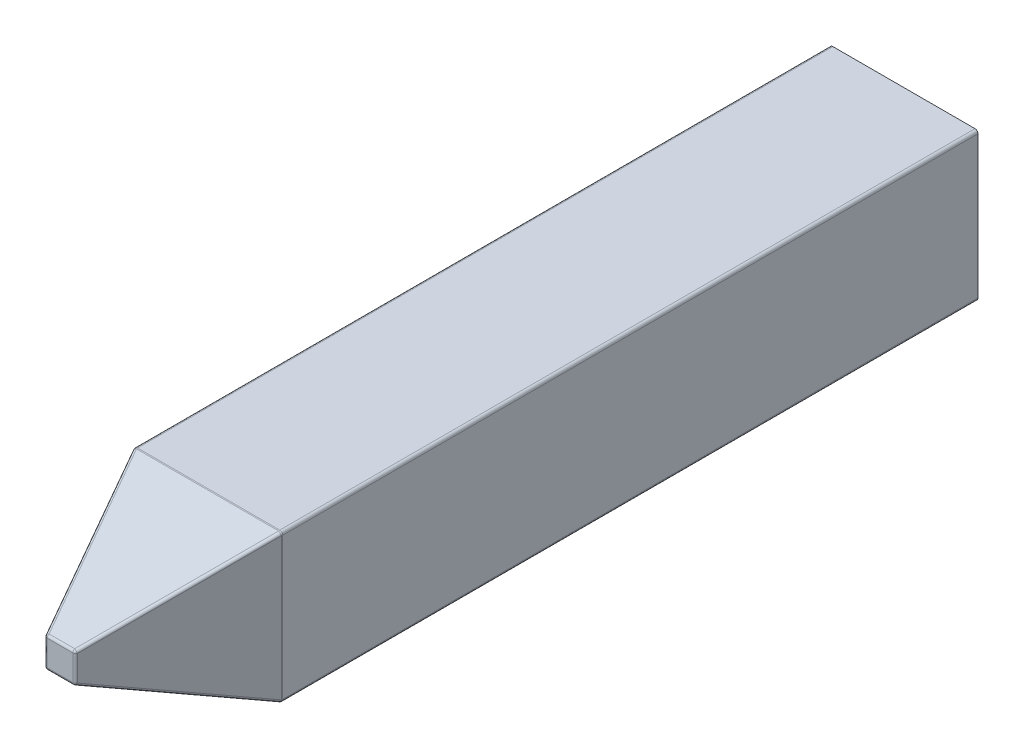
ISO-10303-21;
HEADER;
FILE_DESCRIPTION(('STEP AP214'),'2;1');
FILE_NAME('part.step','',(''),(''),'','','');
FILE_SCHEMA(('AUTOMOTIVE_DESIGN { 1 0 10303 214 1 1 1 1 }'));
ENDSEC;
DATA;
#1=APPLICATION_CONTEXT('core data for automotive mechanical design processes');
#2=APPLICATION_PROTOCOL_DEFINITION('international standard','automotive_design',2000,#1);
#3=PRODUCT_CONTEXT('',#1,'mechanical');
#4=PRODUCT('Part','Part','',(#3));
#5=PRODUCT_RELATED_PRODUCT_CATEGORY('part','',(#4));
#6=PRODUCT_DEFINITION_FORMATION('','',#4);
#7=PRODUCT_DEFINITION_CONTEXT('part definition',#1,'design');
#8=PRODUCT_DEFINITION('design','',#6,#7);
#9=PRODUCT_DEFINITION_SHAPE('','',#8);
#10=(LENGTH_UNIT() NAMED_UNIT(*) SI_UNIT(.MILLI.,.METRE.));
#11=(NAMED_UNIT(*) PLANE_ANGLE_UNIT() SI_UNIT($,.RADIAN.));
#12=(NAMED_UNIT(*) SI_UNIT($,.STERADIAN.) SOLID_ANGLE_UNIT());
#13=UNCERTAINTY_MEASURE_WITH_UNIT(LENGTH_MEASURE(1.E-05),#10,'distance_accuracy_value','');
#14=(GEOMETRIC_REPRESENTATION_CONTEXT(3) GLOBAL_UNCERTAINTY_ASSIGNED_CONTEXT((#13)) GLOBAL_UNIT_ASSIGNED_CONTEXT((#10,
#11,#12)) REPRESENTATION_CONTEXT('',''));
#15=CARTESIAN_POINT('',(0.,0.,0.));
#16=DIRECTION('',(0.,0.,1.));
#17=DIRECTION('',(1.,0.,0.));
#18=AXIS2_PLACEMENT_3D('',#15,#16,#17);
#19=CARTESIAN_POINT('',(0.,10.25,1.5));
#20=DIRECTION('',(0.,0.,-1.));
#21=DIRECTION('',(0.,-1.,0.));
#22=AXIS2_PLACEMENT_3D('',#19,#20,#21);
#23=PLANE('',#22);
#24=DIRECTION('',(0.,1.,0.));
#25=VECTOR('',#24,1.);
#26=CARTESIAN_POINT('',(4.25,-0.25,1.5));
#27=LINE('',#26,#25);
#28=CARTESIAN_POINT('',(4.25,-0.24,1.5));
#29=VERTEX_POINT('',#28);
#30=CARTESIAN_POINT('',(4.25,0.24,1.5));
#31=VERTEX_POINT('',#30);
#32=EDGE_CURVE('E11',#29,#31,#27,.T.);
#33=ORIENTED_EDGE('',*,*,#32,.F.);
#34=CARTESIAN_POINT('',(4.24,-0.24,1.5));
#35=DIRECTION('',(0.,0.,1.));
#36=DIRECTION('',(-1.,0.,0.));
#37=AXIS2_PLACEMENT_3D('',#34,#35,#36);
#38=CIRCLE('',#37,0.01);
#39=CARTESIAN_POINT('',(4.24,-0.25,1.5));
#40=VERTEX_POINT('',#39);
#41=EDGE_CURVE('E360',#40,#29,#38,.T.);
#42=ORIENTED_EDGE('',*,*,#41,.F.);
#43=DIRECTION('',(1.,0.,0.));
#44=VECTOR('',#43,1.);
#45=CARTESIAN_POINT('',(3.75,-0.25,1.5));
#46=LINE('',#45,#44);
#47=CARTESIAN_POINT('',(3.76,-0.25,1.5));
#48=VERTEX_POINT('',#47);
#49=EDGE_CURVE('E199',#48,#40,#46,.T.);
#50=ORIENTED_EDGE('',*,*,#49,.F.);
#51=CARTESIAN_POINT('',(3.76,-0.24,1.5));
#52=DIRECTION('',(0.,0.,1.));
#53=DIRECTION('',(-1.,0.,0.));
#54=AXIS2_PLACEMENT_3D('',#51,#52,#53);
#55=CIRCLE('',#54,0.01);
#56=CARTESIAN_POINT('',(3.75,-0.24,1.5));
#57=VERTEX_POINT('',#56);
#58=EDGE_CURVE('E245',#57,#48,#55,.T.);
#59=ORIENTED_EDGE('',*,*,#58,.F.);
#60=DIRECTION('',(0.,-1.,0.));
#61=VECTOR('',#60,1.);
#62=CARTESIAN_POINT('',(3.75,0.25,1.5));
#63=LINE('',#62,#61);
#64=CARTESIAN_POINT('',(3.75,0.24,1.5));
#65=VERTEX_POINT('',#64);
#66=EDGE_CURVE('E187',#65,#57,#63,.T.);
#67=ORIENTED_EDGE('',*,*,#66,.F.);
#68=CARTESIAN_POINT('',(3.76,0.24,1.5));
#69=DIRECTION('',(0.,0.,1.));
#70=DIRECTION('',(-1.,0.,0.));
#71=AXIS2_PLACEMENT_3D('',#68,#69,#70);
#72=CIRCLE('',#71,0.01);
#73=CARTESIAN_POINT('',(3.76,0.25,1.5));
#74=VERTEX_POINT('',#73);
#75=EDGE_CURVE('E185',#74,#65,#72,.T.);
#76=ORIENTED_EDGE('',*,*,#75,.F.);
#77=DIRECTION('',(-1.,0.,0.));
#78=VECTOR('',#77,1.);
#79=CARTESIAN_POINT('',(4.25,0.25,1.5));
#80=LINE('',#79,#78);
#81=CARTESIAN_POINT('',(4.24,0.25,1.5));
#82=VERTEX_POINT('',#81);
#83=EDGE_CURVE('E28',#82,#74,#80,.T.);
#84=ORIENTED_EDGE('',*,*,#83,.F.);
#85=CARTESIAN_POINT('',(4.24,0.24,1.5));
#86=DIRECTION('',(0.,0.,1.));
#87=DIRECTION('',(-1.,0.,0.));
#88=AXIS2_PLACEMENT_3D('',#85,#86,#87);
#89=CIRCLE('',#88,0.01);
#90=EDGE_CURVE('E301',#31,#82,#89,.T.);
#91=ORIENTED_EDGE('',*,*,#90,.F.);
#92=EDGE_LOOP('',(#33,#42,#50,#59,#67,#76,#84,#91));
#93=FACE_BOUND('',#92,.T.);
#94=ADVANCED_FACE('F17',(#93),#23,.T.);
#95=CARTESIAN_POINT('',(4.25,-0.25,-1.15));
#96=DIRECTION('',(1.,0.,0.));
#97=DIRECTION('',(0.,1.,0.));
#98=AXIS2_PLACEMENT_3D('',#95,#96,#97);
#99=PLANE('',#98);
#100=DIRECTION('',(0.,0.,1.));
#101=VECTOR('',#100,1.);
#102=CARTESIAN_POINT('',(4.25,-0.24,-1.15));
#103=LINE('',#102,#101);
#104=CARTESIAN_POINT('',(4.25,-0.24,3.848074175964));
#105=VERTEX_POINT('',#104);
#106=EDGE_CURVE('E246',#29,#105,#103,.T.);
#107=ORIENTED_EDGE('',*,*,#106,.F.);
#108=ORIENTED_EDGE('',*,*,#32,.T.);
#109=DIRECTION('',(0.,0.,-1.));
#110=VECTOR('',#109,1.);
#111=CARTESIAN_POINT('',(4.25,0.24,-1.15));
#112=LINE('',#111,#110);
#113=CARTESIAN_POINT('',(4.25,0.24,3.848074175964));
#114=VERTEX_POINT('',#113);
#115=EDGE_CURVE('E349',#114,#31,#112,.T.);
#116=ORIENTED_EDGE('',*,*,#115,.F.);
#117=DIRECTION('',(0.,1.,0.));
#118=VECTOR('',#117,1.);
#119=CARTESIAN_POINT('',(4.25,-0.1875,3.848074175964));
#120=LINE('',#119,#118);
#121=EDGE_CURVE('E252',#105,#114,#120,.T.);
#122=ORIENTED_EDGE('',*,*,#121,.F.);
#123=EDGE_LOOP('',(#107,#108,#116,#122));
#124=FACE_BOUND('',#123,.T.);
#125=ADVANCED_FACE('F425',(#124),#99,.T.);
#126=CARTESIAN_POINT('',(4.25,0.25,-1.15));
#127=DIRECTION('',(0.,1.,0.));
#128=DIRECTION('',(1.,0.,0.));
#129=AXIS2_PLACEMENT_3D('',#126,#127,#128);
#130=PLANE('',#129);
#131=DIRECTION('',(0.,0.,1.));
#132=VECTOR('',#131,1.);
#133=CARTESIAN_POINT('',(4.24,0.25,-1.15));
#134=LINE('',#133,#132);
#135=CARTESIAN_POINT('',(4.24,0.25,3.848074175964));
#136=VERTEX_POINT('',#135);
#137=EDGE_CURVE('E180',#82,#136,#134,.T.);
#138=ORIENTED_EDGE('',*,*,#137,.F.);
#139=ORIENTED_EDGE('',*,*,#83,.T.);
#140=DIRECTION('',(0.,0.,-1.));
#141=VECTOR('',#140,1.);
#142=CARTESIAN_POINT('',(3.76,0.25,-1.15));
#143=LINE('',#142,#141);
#144=CARTESIAN_POINT('',(3.76,0.25,3.848074175964));
#145=VERTEX_POINT('',#144);
#146=EDGE_CURVE('E178',#145,#74,#143,.T.);
#147=ORIENTED_EDGE('',*,*,#146,.F.);
#148=DIRECTION('',(-1.,0.,0.));
#149=VECTOR('',#148,1.);
#150=CARTESIAN_POINT('',(4.1875,0.25,3.848074175964));
#151=LINE('',#150,#149);
#152=EDGE_CURVE('E209',#136,#145,#151,.T.);
#153=ORIENTED_EDGE('',*,*,#152,.F.);
#154=EDGE_LOOP('',(#138,#139,#147,#153));
#155=FACE_BOUND('',#154,.T.);
#156=ADVANCED_FACE('F175',(#155),#130,.T.);
#157=CARTESIAN_POINT('',(4.24,0.24,-1.15));
#158=DIRECTION('',(0.,0.,1.));
#159=DIRECTION('',(0.707106781186548,0.707106781186548,0.));
#160=AXIS2_PLACEMENT_3D('',#157,#158,#159);
#161=CYLINDRICAL_SURFACE('',#160,0.01);
#162=ORIENTED_EDGE('',*,*,#115,.T.);
#163=ORIENTED_EDGE('',*,*,#90,.T.);
#164=ORIENTED_EDGE('',*,*,#137,.T.);
#165=CARTESIAN_POINT('',(4.24,0.24,3.848074175964));
#166=DIRECTION('',(0.,0.,-1.));
#167=DIRECTION('',(0.,1.,0.));
#168=AXIS2_PLACEMENT_3D('',#165,#166,#167);
#169=CIRCLE('',#168,0.01);
#170=EDGE_CURVE('E232',#136,#114,#169,.T.);
#171=ORIENTED_EDGE('',*,*,#170,.T.);
#172=EDGE_LOOP('',(#162,#163,#164,#171));
#173=FACE_BOUND('',#172,.T.);
#174=ADVANCED_FACE('F418',(#173),#161,.T.);
#175=CARTESIAN_POINT('',(3.75,0.25,-1.15));
#176=DIRECTION('',(-1.,0.,0.));
#177=DIRECTION('',(0.,0.,1.));
#178=AXIS2_PLACEMENT_3D('',#175,#176,#177);
#179=PLANE('',#178);
#180=DIRECTION('',(0.,0.,1.));
#181=VECTOR('',#180,1.);
#182=CARTESIAN_POINT('',(3.75,0.24,-1.15));
#183=LINE('',#182,#181);
#184=CARTESIAN_POINT('',(3.75,0.24,3.848074175964));
#185=VERTEX_POINT('',#184);
#186=EDGE_CURVE('E192',#65,#185,#183,.T.);
#187=ORIENTED_EDGE('',*,*,#186,.F.);
#188=ORIENTED_EDGE('',*,*,#66,.T.);
#189=DIRECTION('',(0.,0.,-1.));
#190=VECTOR('',#189,1.);
#191=CARTESIAN_POINT('',(3.75,-0.24,-1.15));
#192=LINE('',#191,#190);
#193=CARTESIAN_POINT('',(3.75,-0.24,3.848074175964));
#194=VERTEX_POINT('',#193);
#195=EDGE_CURVE('E241',#194,#57,#192,.T.);
#196=ORIENTED_EDGE('',*,*,#195,.F.);
#197=DIRECTION('',(0.,-1.,0.));
#198=VECTOR('',#197,1.);
#199=CARTESIAN_POINT('',(3.75,0.1875,3.848074175964));
#200=LINE('',#199,#198);
#201=EDGE_CURVE('E309',#185,#194,#200,.T.);
#202=ORIENTED_EDGE('',*,*,#201,.F.);
#203=EDGE_LOOP('',(#187,#188,#196,#202));
#204=FACE_BOUND('',#203,.T.);
#205=ADVANCED_FACE('F440',(#204),#179,.T.);
#206=CARTESIAN_POINT('',(3.76,0.24,-1.15));
#207=DIRECTION('',(0.,0.,1.));
#208=DIRECTION('',(-0.707106781186548,0.707106781186548,0.));
#209=AXIS2_PLACEMENT_3D('',#206,#207,#208);
#210=CYLINDRICAL_SURFACE('',#209,0.01);
#211=ORIENTED_EDGE('',*,*,#146,.T.);
#212=ORIENTED_EDGE('',*,*,#75,.T.);
#213=ORIENTED_EDGE('',*,*,#186,.T.);
#214=CARTESIAN_POINT('',(3.76,0.24,3.848074175964));
#215=DIRECTION('',(0.,0.,-1.));
#216=DIRECTION('',(-1.,0.,0.));
#217=AXIS2_PLACEMENT_3D('',#214,#215,#216);
#218=CIRCLE('',#217,0.01);
#219=EDGE_CURVE('E196',#185,#145,#218,.T.);
#220=ORIENTED_EDGE('',*,*,#219,.T.);
#221=EDGE_LOOP('',(#211,#212,#213,#220));
#222=FACE_BOUND('',#221,.T.);
#223=ADVANCED_FACE('F194',(#222),#210,.T.);
#224=CARTESIAN_POINT('',(3.75,-0.25,-1.15));
#225=DIRECTION('',(0.,-1.,0.));
#226=DIRECTION('',(0.,0.,-1.));
#227=AXIS2_PLACEMENT_3D('',#224,#225,#226);
#228=PLANE('',#227);
#229=DIRECTION('',(0.,0.,1.));
#230=VECTOR('',#229,1.);
#231=CARTESIAN_POINT('',(3.76,-0.25,-1.15));
#232=LINE('',#231,#230);
#233=CARTESIAN_POINT('',(3.76,-0.25,3.848074175964));
#234=VERTEX_POINT('',#233);
#235=EDGE_CURVE('E205',#48,#234,#232,.T.);
#236=ORIENTED_EDGE('',*,*,#235,.F.);
#237=ORIENTED_EDGE('',*,*,#49,.T.);
#238=DIRECTION('',(0.,0.,-1.));
#239=VECTOR('',#238,1.);
#240=CARTESIAN_POINT('',(4.24,-0.25,-1.15));
#241=LINE('',#240,#239);
#242=CARTESIAN_POINT('',(4.24,-0.25,3.848074175964));
#243=VERTEX_POINT('',#242);
#244=EDGE_CURVE('E269',#243,#40,#241,.T.);
#245=ORIENTED_EDGE('',*,*,#244,.F.);
#246=DIRECTION('',(1.,0.,0.));
#247=VECTOR('',#246,1.);
#248=CARTESIAN_POINT('',(3.8125,-0.25,3.848074175964));
#249=LINE('',#248,#247);
#250=EDGE_CURVE('E248',#234,#243,#249,.T.);
#251=ORIENTED_EDGE('',*,*,#250,.F.);
#252=EDGE_LOOP('',(#236,#237,#245,#251));
#253=FACE_BOUND('',#252,.T.);
#254=ADVANCED_FACE('F434',(#253),#228,.T.);
#255=CARTESIAN_POINT('',(3.76,-0.24,-1.15));
#256=DIRECTION('',(0.,0.,-1.));
#257=DIRECTION('',(-0.707106781186548,-0.707106781186548,0.));
#258=AXIS2_PLACEMENT_3D('',#255,#256,#257);
#259=CYLINDRICAL_SURFACE('',#258,0.01);
#260=ORIENTED_EDGE('',*,*,#195,.T.);
#261=ORIENTED_EDGE('',*,*,#58,.T.);
#262=ORIENTED_EDGE('',*,*,#235,.T.);
#263=CARTESIAN_POINT('',(3.76,-0.24,3.848074175964));
#264=DIRECTION('',(0.,0.,-1.));
#265=DIRECTION('',(0.,-1.,0.));
#266=AXIS2_PLACEMENT_3D('',#263,#264,#265);
#267=CIRCLE('',#266,0.01);
#268=EDGE_CURVE('E265',#234,#194,#267,.T.);
#269=ORIENTED_EDGE('',*,*,#268,.T.);
#270=EDGE_LOOP('',(#260,#261,#262,#269));
#271=FACE_BOUND('',#270,.T.);
#272=ADVANCED_FACE('F436',(#271),#259,.T.);
#273=CARTESIAN_POINT('',(4.24,-0.24,-1.15));
#274=DIRECTION('',(0.,0.,1.));
#275=DIRECTION('',(0.707106781186548,-0.707106781186548,0.));
#276=AXIS2_PLACEMENT_3D('',#273,#274,#275);
#277=CYLINDRICAL_SURFACE('',#276,0.01);
#278=ORIENTED_EDGE('',*,*,#244,.T.);
#279=ORIENTED_EDGE('',*,*,#41,.T.);
#280=ORIENTED_EDGE('',*,*,#106,.T.);
#281=CARTESIAN_POINT('',(4.24,-0.24,3.848074175964));
#282=DIRECTION('',(0.,0.,-1.));
#283=DIRECTION('',(1.,0.,0.));
#284=AXIS2_PLACEMENT_3D('',#281,#282,#283);
#285=CIRCLE('',#284,0.01);
#286=EDGE_CURVE('E235',#105,#243,#285,.T.);
#287=ORIENTED_EDGE('',*,*,#286,.T.);
#288=EDGE_LOOP('',(#278,#279,#280,#287));
#289=FACE_BOUND('',#288,.T.);
#290=ADVANCED_FACE('F430',(#289),#277,.T.);
#291=CARTESIAN_POINT('',(3.76,-0.24,3.848074175964));
#292=DIRECTION('',(0.,0.,1.));
#293=DIRECTION('',(1.,0.,0.));
#294=AXIS2_PLACEMENT_3D('',#291,#292,#293);
#295=SPHERICAL_SURFACE('',#294,0.01);
#296=CARTESIAN_POINT('',(3.76,-0.24,3.848074175964));
#297=DIRECTION('',(0.,1.,0.));
#298=DIRECTION('',(-1.,0.,0.));
#299=AXIS2_PLACEMENT_3D('',#296,#297,#298);
#300=CIRCLE('',#299,0.01);
#301=CARTESIAN_POINT('',(3.750715233091,-0.24,3.851788082728));
#302=VERTEX_POINT('',#301);
#303=EDGE_CURVE('E324',#194,#302,#300,.T.);
#304=ORIENTED_EDGE('',*,*,#303,.F.);
#305=ORIENTED_EDGE('',*,*,#268,.F.);
#306=CARTESIAN_POINT('',(3.76,-0.24,3.848074175964));
#307=DIRECTION('',(1.,0.,0.));
#308=DIRECTION('',(0.,-0.928476690885259,0.371390676354104));
#309=AXIS2_PLACEMENT_3D('',#306,#307,#308);
#310=CIRCLE('',#309,0.009999999999999);
#311=CARTESIAN_POINT('',(3.76,-0.249284766909,3.851788082728));
#312=VERTEX_POINT('',#311);
#313=EDGE_CURVE('E279',#312,#234,#310,.T.);
#314=ORIENTED_EDGE('',*,*,#313,.F.);
#315=CARTESIAN_POINT('',(3.76,-0.24,3.848074175964));
#316=DIRECTION('',(0.348155311911459,0.348155311910941,0.870388279778646));
#317=DIRECTION('',(-0.928476690885259,0.,0.371390676354104));
#318=AXIS2_PLACEMENT_3D('',#315,#316,#317);
#319=CIRCLE('',#318,0.009999999999999);
#320=EDGE_CURVE('E298',#302,#312,#319,.T.);
#321=ORIENTED_EDGE('',*,*,#320,.F.);
#322=EDGE_LOOP('',(#304,#305,#314,#321));
#323=FACE_BOUND('',#322,.T.);
#324=ADVANCED_FACE('F743',(#323),#295,.T.);
#325=CARTESIAN_POINT('',(4.24,-0.24,3.848074175964));
#326=DIRECTION('',(0.,0.,1.));
#327=DIRECTION('',(1.,0.,0.));
#328=AXIS2_PLACEMENT_3D('',#325,#326,#327);
#329=SPHERICAL_SURFACE('',#328,0.01);
#330=CARTESIAN_POINT('',(4.24,-0.24,3.848074175964));
#331=DIRECTION('',(-0.348155311910942,0.348155311911459,0.870388279778646));
#332=DIRECTION('',(0.,-0.928476690885259,0.371390676354104));
#333=AXIS2_PLACEMENT_3D('',#330,#331,#332);
#334=CIRCLE('',#333,0.01);
#335=CARTESIAN_POINT('',(4.24,-0.249284766909,3.851788082728));
#336=VERTEX_POINT('',#335);
#337=CARTESIAN_POINT('',(4.249284766909,-0.24,3.851788082728));
#338=VERTEX_POINT('',#337);
#339=EDGE_CURVE('E339',#336,#338,#334,.T.);
#340=ORIENTED_EDGE('',*,*,#339,.F.);
#341=CARTESIAN_POINT('',(4.24,-0.24,3.848074175964));
#342=DIRECTION('',(-1.,0.,0.));
#343=DIRECTION('',(0.,-1.,0.));
#344=AXIS2_PLACEMENT_3D('',#341,#342,#343);
#345=CIRCLE('',#344,0.01);
#346=EDGE_CURVE('E306',#243,#336,#345,.T.);
#347=ORIENTED_EDGE('',*,*,#346,.F.);
#348=ORIENTED_EDGE('',*,*,#286,.F.);
#349=CARTESIAN_POINT('',(4.24,-0.24,3.848074175964));
#350=DIRECTION('',(0.,1.,0.));
#351=DIRECTION('',(0.928476690885259,0.,0.371390676354104));
#352=AXIS2_PLACEMENT_3D('',#349,#350,#351);
#353=CIRCLE('',#352,0.009999999999999);
#354=EDGE_CURVE('E285',#338,#105,#353,.T.);
#355=ORIENTED_EDGE('',*,*,#354,.F.);
#356=EDGE_LOOP('',(#340,#347,#348,#355));
#357=FACE_BOUND('',#356,.T.);
#358=ADVANCED_FACE('F776',(#357),#329,.T.);
#359=CARTESIAN_POINT('',(4.24,0.24,3.848074175964));
#360=DIRECTION('',(0.,0.,1.));
#361=DIRECTION('',(1.,0.,0.));
#362=AXIS2_PLACEMENT_3D('',#359,#360,#361);
#363=SPHERICAL_SURFACE('',#362,0.009999999999999);
#364=ORIENTED_EDGE('',*,*,#170,.F.);
#365=CARTESIAN_POINT('',(4.24,0.24,3.848074175964));
#366=DIRECTION('',(-1.,0.,0.));
#367=DIRECTION('',(0.,0.928476690885259,0.371390676354104));
#368=AXIS2_PLACEMENT_3D('',#365,#366,#367);
#369=CIRCLE('',#368,0.009999999999999);
#370=CARTESIAN_POINT('',(4.24,0.249284766909,3.851788082728));
#371=VERTEX_POINT('',#370);
#372=EDGE_CURVE('E217',#371,#136,#369,.T.);
#373=ORIENTED_EDGE('',*,*,#372,.F.);
#374=CARTESIAN_POINT('',(4.24,0.24,3.848074175964));
#375=DIRECTION('',(-0.348155311911459,-0.348155311910941,0.870388279778646));
#376=DIRECTION('',(0.928476690885259,0.,0.371390676354104));
#377=AXIS2_PLACEMENT_3D('',#374,#375,#376);
#378=CIRCLE('',#377,0.009999999999999);
#379=CARTESIAN_POINT('',(4.249284766909,0.24,3.851788082728));
#380=VERTEX_POINT('',#379);
#381=EDGE_CURVE('E230',#380,#371,#378,.T.);
#382=ORIENTED_EDGE('',*,*,#381,.F.);
#383=CARTESIAN_POINT('',(4.24,0.24,3.848074175964));
#384=DIRECTION('',(0.,-1.,0.));
#385=DIRECTION('',(1.,0.,0.));
#386=AXIS2_PLACEMENT_3D('',#383,#384,#385);
#387=CIRCLE('',#386,0.01);
#388=EDGE_CURVE('E289',#114,#380,#387,.T.);
#389=ORIENTED_EDGE('',*,*,#388,.F.);
#390=EDGE_LOOP('',(#364,#373,#382,#389));
#391=FACE_BOUND('',#390,.T.);
#392=ADVANCED_FACE('F692',(#391),#363,.T.);
#393=CARTESIAN_POINT('',(3.76,0.24,3.848074175964));
#394=DIRECTION('',(0.,0.,1.));
#395=DIRECTION('',(1.,0.,0.));
#396=AXIS2_PLACEMENT_3D('',#393,#394,#395);
#397=SPHERICAL_SURFACE('',#396,0.009999999999999);
#398=CARTESIAN_POINT('',(3.76,0.24,3.848074175964));
#399=DIRECTION('',(0.,-1.,0.));
#400=DIRECTION('',(-0.928476690885259,0.,0.371390676354104));
#401=AXIS2_PLACEMENT_3D('',#398,#399,#400);
#402=CIRCLE('',#401,0.009999999999999);
#403=CARTESIAN_POINT('',(3.750715233091,0.24,3.851788082728));
#404=VERTEX_POINT('',#403);
#405=EDGE_CURVE('E320',#404,#185,#402,.T.);
#406=ORIENTED_EDGE('',*,*,#405,.F.);
#407=CARTESIAN_POINT('',(3.76,0.24,3.848074175964));
#408=DIRECTION('',(0.348155311910941,-0.348155311911459,0.870388279778646));
#409=DIRECTION('',(0.,0.928476690885259,0.371390676354104));
#410=AXIS2_PLACEMENT_3D('',#407,#408,#409);
#411=CIRCLE('',#410,0.009999999999999);
#412=CARTESIAN_POINT('',(3.76,0.249284766909,3.851788082728));
#413=VERTEX_POINT('',#412);
#414=EDGE_CURVE('E226',#413,#404,#411,.T.);
#415=ORIENTED_EDGE('',*,*,#414,.F.);
#416=CARTESIAN_POINT('',(3.76,0.24,3.848074175964));
#417=DIRECTION('',(1.,0.,0.));
#418=DIRECTION('',(0.,1.,0.));
#419=AXIS2_PLACEMENT_3D('',#416,#417,#418);
#420=CIRCLE('',#419,0.01);
#421=EDGE_CURVE('E221',#145,#413,#420,.T.);
#422=ORIENTED_EDGE('',*,*,#421,.F.);
#423=ORIENTED_EDGE('',*,*,#219,.F.);
#424=EDGE_LOOP('',(#406,#415,#422,#423));
#425=FACE_BOUND('',#424,.T.);
#426=ADVANCED_FACE('F443',(#425),#397,.T.);
#427=CARTESIAN_POINT('',(3.8125,-0.24,3.848074175964));
#428=DIRECTION('',(1.,0.,0.));
#429=DIRECTION('',(0.,-0.981956386731398,0.189107521155077));
#430=AXIS2_PLACEMENT_3D('',#427,#428,#429);
#431=CYLINDRICAL_SURFACE('',#430,0.01);
#432=ORIENTED_EDGE('',*,*,#346,.T.);
#433=DIRECTION('',(-1.,0.,0.));
#434=VECTOR('',#433,1.);
#435=CARTESIAN_POINT('',(3.8125,-0.249284766909,3.851788082728));
#436=LINE('',#435,#434);
#437=EDGE_CURVE('E211',#336,#312,#436,.T.);
#438=ORIENTED_EDGE('',*,*,#437,.T.);
#439=ORIENTED_EDGE('',*,*,#313,.T.);
#440=ORIENTED_EDGE('',*,*,#250,.T.);
#441=EDGE_LOOP('',(#432,#438,#439,#440));
#442=FACE_BOUND('',#441,.T.);
#443=ADVANCED_FACE('F691',(#442),#431,.T.);
#444=CARTESIAN_POINT('',(3.76,0.1875,3.848074175964));
#445=DIRECTION('',(0.,-1.,0.));
#446=DIRECTION('',(-0.981956386731398,0.,0.189107521155077));
#447=AXIS2_PLACEMENT_3D('',#444,#445,#446);
#448=CYLINDRICAL_SURFACE('',#447,0.01);
#449=ORIENTED_EDGE('',*,*,#303,.T.);
#450=DIRECTION('',(0.,1.,0.));
#451=VECTOR('',#450,1.);
#452=CARTESIAN_POINT('',(3.750715233091,0.1875,3.851788082728));
#453=LINE('',#452,#451);
#454=EDGE_CURVE('E225',#302,#404,#453,.T.);
#455=ORIENTED_EDGE('',*,*,#454,.T.);
#456=ORIENTED_EDGE('',*,*,#405,.T.);
#457=ORIENTED_EDGE('',*,*,#201,.T.);
#458=EDGE_LOOP('',(#449,#455,#456,#457));
#459=FACE_BOUND('',#458,.T.);
#460=ADVANCED_FACE('F797',(#459),#448,.T.);
#461=CARTESIAN_POINT('',(4.1875,0.24,3.848074175964));
#462=DIRECTION('',(-1.,0.,0.));
#463=DIRECTION('',(0.,0.981956386731398,0.189107521155077));
#464=AXIS2_PLACEMENT_3D('',#461,#462,#463);
#465=CYLINDRICAL_SURFACE('',#464,0.01);
#466=ORIENTED_EDGE('',*,*,#421,.T.);
#467=DIRECTION('',(1.,0.,0.));
#468=VECTOR('',#467,1.);
#469=CARTESIAN_POINT('',(4.1875,0.249284766909,3.851788082728));
#470=LINE('',#469,#468);
#471=EDGE_CURVE('E240',#413,#371,#470,.T.);
#472=ORIENTED_EDGE('',*,*,#471,.T.);
#473=ORIENTED_EDGE('',*,*,#372,.T.);
#474=ORIENTED_EDGE('',*,*,#152,.T.);
#475=EDGE_LOOP('',(#466,#472,#473,#474));
#476=FACE_BOUND('',#475,.T.);
#477=ADVANCED_FACE('F447',(#476),#465,.T.);
#478=CARTESIAN_POINT('',(4.24,-0.1875,3.848074175964));
#479=DIRECTION('',(0.,1.,0.));
#480=DIRECTION('',(0.981956386731398,0.,0.189107521155077));
#481=AXIS2_PLACEMENT_3D('',#478,#479,#480);
#482=CYLINDRICAL_SURFACE('',#481,0.01);
#483=ORIENTED_EDGE('',*,*,#388,.T.);
#484=DIRECTION('',(0.,-1.,0.));
#485=VECTOR('',#484,1.);
#486=CARTESIAN_POINT('',(4.249284766909,-0.1875,3.851788082728));
#487=LINE('',#486,#485);
#488=EDGE_CURVE('E295',#380,#338,#487,.T.);
#489=ORIENTED_EDGE('',*,*,#488,.T.);
#490=ORIENTED_EDGE('',*,*,#354,.T.);
#491=ORIENTED_EDGE('',*,*,#121,.T.);
#492=EDGE_LOOP('',(#483,#489,#490,#491));
#493=FACE_BOUND('',#492,.T.);
#494=ADVANCED_FACE('F817',(#493),#482,.T.);
#495=CARTESIAN_POINT('',(3.876341158799,-0.123658841201,4.138927072961));
#496=DIRECTION('',(0.348155311911075,0.348155311911075,0.870388279778746));
#497=DIRECTION('',(-0.615457454896845,-0.615457454896845,0.492365963916877));
#498=AXIS2_PLACEMENT_3D('',#495,#496,#497);
#499=CYLINDRICAL_SURFACE('',#498,0.01);
#500=CARTESIAN_POINT('',(3.956770329614,-0.04322967038573,4.34));
#501=DIRECTION('',(-0.348155311910941,-0.348155311911459,-0.870388279778646));
#502=DIRECTION('',(0.,-0.928476690885259,0.371390676354104));
#503=AXIS2_PLACEMENT_3D('',#500,#501,#502);
#504=CIRCLE('',#503,0.01);
#505=CARTESIAN_POINT('',(3.956770329614,-0.05251443729458,4.343713906764));
#506=VERTEX_POINT('',#505);
#507=CARTESIAN_POINT('',(3.947485562705,-0.04322967038573,4.343713906764));
#508=VERTEX_POINT('',#507);
#509=EDGE_CURVE('E275',#506,#508,#504,.T.);
#510=ORIENTED_EDGE('',*,*,#509,.T.);
#511=DIRECTION('',(-0.348155311911244,-0.348155311911244,-0.87038827977861));
#512=VECTOR('',#511,1.);
#513=CARTESIAN_POINT('',(3.86705639189,-0.123658841201,4.142640979725));
#514=LINE('',#513,#512);
#515=EDGE_CURVE('E216',#508,#302,#514,.T.);
#516=ORIENTED_EDGE('',*,*,#515,.T.);
#517=ORIENTED_EDGE('',*,*,#320,.T.);
#518=DIRECTION('',(0.348155311911244,0.348155311911244,0.87038827977861));
#519=VECTOR('',#518,1.);
#520=CARTESIAN_POINT('',(3.876341158799,-0.13294360811,4.142640979725));
#521=LINE('',#520,#519);
#522=EDGE_CURVE('E231',#312,#506,#521,.T.);
#523=ORIENTED_EDGE('',*,*,#522,.T.);
#524=EDGE_LOOP('',(#510,#516,#517,#523));
#525=FACE_BOUND('',#524,.T.);
#526=ADVANCED_FACE('F888',(#525),#499,.T.);
#527=CARTESIAN_POINT('',(4.123658841201,-0.123658841201,4.138927072961));
#528=DIRECTION('',(0.348155311911075,-0.348155311911075,-0.870388279778746));
#529=DIRECTION('',(0.615457454896845,-0.615457454896845,0.492365963916877));
#530=AXIS2_PLACEMENT_3D('',#527,#528,#529);
#531=CYLINDRICAL_SURFACE('',#530,0.01);
#532=ORIENTED_EDGE('',*,*,#339,.T.);
#533=DIRECTION('',(-0.348155311911244,0.348155311911244,0.87038827977861));
#534=VECTOR('',#533,1.);
#535=CARTESIAN_POINT('',(4.13294360811,-0.123658841201,4.142640979725));
#536=LINE('',#535,#534);
#537=CARTESIAN_POINT('',(4.052514437295,-0.04322967038573,4.343713906764));
#538=VERTEX_POINT('',#537);
#539=EDGE_CURVE('E274',#338,#538,#536,.T.);
#540=ORIENTED_EDGE('',*,*,#539,.T.);
#541=CARTESIAN_POINT('',(4.043229670386,-0.04322967038573,4.34));
#542=DIRECTION('',(0.348155311911459,-0.348155311910941,-0.870388279778646));
#543=DIRECTION('',(0.928476690885259,0.,0.371390676354104));
#544=AXIS2_PLACEMENT_3D('',#541,#542,#543);
#545=CIRCLE('',#544,0.009999999999999);
#546=CARTESIAN_POINT('',(4.043229670386,-0.05251443729458,4.343713906764));
#547=VERTEX_POINT('',#546);
#548=EDGE_CURVE('E280',#538,#547,#545,.T.);
#549=ORIENTED_EDGE('',*,*,#548,.T.);
#550=DIRECTION('',(0.348155311911244,-0.348155311911244,-0.87038827977861));
#551=VECTOR('',#550,1.);
#552=CARTESIAN_POINT('',(4.123658841201,-0.13294360811,4.142640979725));
#553=LINE('',#552,#551);
#554=EDGE_CURVE('E215',#547,#336,#553,.T.);
#555=ORIENTED_EDGE('',*,*,#554,.T.);
#556=EDGE_LOOP('',(#532,#540,#549,#555));
#557=FACE_BOUND('',#556,.T.);
#558=ADVANCED_FACE('F726',(#557),#531,.T.);
#559=CARTESIAN_POINT('',(4.123658841201,0.123658841201,4.138927072961));
#560=DIRECTION('',(-0.348155311911075,-0.348155311911075,0.870388279778746));
#561=DIRECTION('',(0.615457454896845,0.615457454896845,0.492365963916877));
#562=AXIS2_PLACEMENT_3D('',#559,#560,#561);
#563=CYLINDRICAL_SURFACE('',#562,0.01);
#564=CARTESIAN_POINT('',(4.043229670386,0.04322967038573,4.34));
#565=DIRECTION('',(0.348155311910941,0.348155311911459,-0.870388279778646));
#566=DIRECTION('',(0.,0.928476690885259,0.371390676354104));
#567=AXIS2_PLACEMENT_3D('',#564,#565,#566);
#568=CIRCLE('',#567,0.01);
#569=CARTESIAN_POINT('',(4.043229670386,0.05251443729458,4.343713906764));
#570=VERTEX_POINT('',#569);
#571=CARTESIAN_POINT('',(4.052514437295,0.04322967038573,4.343713906764));
#572=VERTEX_POINT('',#571);
#573=EDGE_CURVE('E284',#570,#572,#568,.T.);
#574=ORIENTED_EDGE('',*,*,#573,.T.);
#575=DIRECTION('',(0.348155311911244,0.348155311911244,-0.87038827977861));
#576=VECTOR('',#575,1.);
#577=CARTESIAN_POINT('',(4.13294360811,0.123658841201,4.142640979725));
#578=LINE('',#577,#576);
#579=EDGE_CURVE('E270',#572,#380,#578,.T.);
#580=ORIENTED_EDGE('',*,*,#579,.T.);
#581=ORIENTED_EDGE('',*,*,#381,.T.);
#582=DIRECTION('',(-0.348155311911244,-0.348155311911244,0.87038827977861));
#583=VECTOR('',#582,1.);
#584=CARTESIAN_POINT('',(4.123658841201,0.13294360811,4.142640979725));
#585=LINE('',#584,#583);
#586=EDGE_CURVE('E302',#371,#570,#585,.T.);
#587=ORIENTED_EDGE('',*,*,#586,.T.);
#588=EDGE_LOOP('',(#574,#580,#581,#587));
#589=FACE_BOUND('',#588,.T.);
#590=ADVANCED_FACE('F721',(#589),#563,.T.);
#591=CARTESIAN_POINT('',(3.876341158799,0.123658841201,4.138927072961));
#592=DIRECTION('',(0.348155311911075,-0.348155311911075,0.870388279778746));
#593=DIRECTION('',(-0.615457454896845,0.615457454896845,0.492365963916877));
#594=AXIS2_PLACEMENT_3D('',#591,#592,#593);
#595=CYLINDRICAL_SURFACE('',#594,0.01);
#596=CARTESIAN_POINT('',(3.956770329614,0.04322967038573,4.34));
#597=DIRECTION('',(-0.348155311911459,0.348155311910941,-0.870388279778646));
#598=DIRECTION('',(-0.928476690885259,0.,0.371390676354104));
#599=AXIS2_PLACEMENT_3D('',#596,#597,#598);
#600=CIRCLE('',#599,0.01);
#601=CARTESIAN_POINT('',(3.947485562705,0.04322967038573,4.343713906764));
#602=VERTEX_POINT('',#601);
#603=CARTESIAN_POINT('',(3.956770329614,0.05251443729458,4.343713906764));
#604=VERTEX_POINT('',#603);
#605=EDGE_CURVE('E21',#602,#604,#600,.T.);
#606=ORIENTED_EDGE('',*,*,#605,.T.);
#607=DIRECTION('',(-0.348155311911244,0.348155311911244,-0.87038827977861));
#608=VECTOR('',#607,1.);
#609=CARTESIAN_POINT('',(3.876341158799,0.13294360811,4.142640979725));
#610=LINE('',#609,#608);
#611=EDGE_CURVE('E305',#604,#413,#610,.T.);
#612=ORIENTED_EDGE('',*,*,#611,.T.);
#613=ORIENTED_EDGE('',*,*,#414,.T.);
#614=DIRECTION('',(0.348155311911244,-0.348155311911244,0.87038827977861));
#615=VECTOR('',#614,1.);
#616=CARTESIAN_POINT('',(3.86705639189,0.123658841201,4.142640979725));
#617=LINE('',#616,#615);
#618=EDGE_CURVE('E237',#404,#602,#617,.T.);
#619=ORIENTED_EDGE('',*,*,#618,.T.);
#620=EDGE_LOOP('',(#606,#612,#613,#619));
#621=FACE_BOUND('',#620,.T.);
#622=ADVANCED_FACE('F725',(#621),#595,.T.);
#623=CARTESIAN_POINT('',(3.875,-0.15,4.1));
#624=DIRECTION('',(0.,-0.928476690885259,0.371390676354104));
#625=DIRECTION('',(-1.,0.,0.));
#626=AXIS2_PLACEMENT_3D('',#623,#624,#625);
#627=PLANE('',#626);
#628=ORIENTED_EDGE('',*,*,#437,.F.);
#629=ORIENTED_EDGE('',*,*,#554,.F.);
#630=DIRECTION('',(1.,0.,0.));
#631=VECTOR('',#630,1.);
#632=CARTESIAN_POINT('',(3.9375,-0.05251443729458,4.343713906764));
#633=LINE('',#632,#631);
#634=EDGE_CURVE('E398',#506,#547,#633,.T.);
#635=ORIENTED_EDGE('',*,*,#634,.F.);
#636=ORIENTED_EDGE('',*,*,#522,.F.);
#637=EDGE_LOOP('',(#628,#629,#635,#636));
#638=FACE_BOUND('',#637,.T.);
#639=ADVANCED_FACE('F760',(#638),#627,.T.);
#640=CARTESIAN_POINT('',(3.85,0.125,4.1));
#641=DIRECTION('',(-0.928476690885259,0.,0.371390676354104));
#642=DIRECTION('',(0.,1.,0.));
#643=AXIS2_PLACEMENT_3D('',#640,#641,#642);
#644=PLANE('',#643);
#645=ORIENTED_EDGE('',*,*,#618,.F.);
#646=ORIENTED_EDGE('',*,*,#454,.F.);
#647=ORIENTED_EDGE('',*,*,#515,.F.);
#648=DIRECTION('',(0.,-1.,0.));
#649=VECTOR('',#648,1.);
#650=CARTESIAN_POINT('',(3.947485562705,0.0625,4.343713906764));
#651=LINE('',#650,#649);
#652=EDGE_CURVE('E258',#602,#508,#651,.T.);
#653=ORIENTED_EDGE('',*,*,#652,.F.);
#654=EDGE_LOOP('',(#645,#646,#647,#653));
#655=FACE_BOUND('',#654,.T.);
#656=ADVANCED_FACE('F851',(#655),#644,.T.);
#657=CARTESIAN_POINT('',(4.125,0.15,4.1));
#658=DIRECTION('',(0.,0.928476690885259,0.371390676354104));
#659=DIRECTION('',(1.,0.,0.));
#660=AXIS2_PLACEMENT_3D('',#657,#658,#659);
#661=PLANE('',#660);
#662=ORIENTED_EDGE('',*,*,#611,.F.);
#663=DIRECTION('',(-1.,0.,0.));
#664=VECTOR('',#663,1.);
#665=CARTESIAN_POINT('',(4.0625,0.05251443729458,4.343713906764));
#666=LINE('',#665,#664);
#667=EDGE_CURVE('E263',#570,#604,#666,.T.);
#668=ORIENTED_EDGE('',*,*,#667,.F.);
#669=ORIENTED_EDGE('',*,*,#586,.F.);
#670=ORIENTED_EDGE('',*,*,#471,.F.);
#671=EDGE_LOOP('',(#662,#668,#669,#670));
#672=FACE_BOUND('',#671,.T.);
#673=ADVANCED_FACE('F855',(#672),#661,.T.);
#674=CARTESIAN_POINT('',(4.15,-0.125,4.1));
#675=DIRECTION('',(0.928476690885259,0.,0.371390676354104));
#676=DIRECTION('',(0.,-1.,0.));
#677=AXIS2_PLACEMENT_3D('',#674,#675,#676);
#678=PLANE('',#677);
#679=ORIENTED_EDGE('',*,*,#579,.F.);
#680=DIRECTION('',(0.,1.,0.));
#681=VECTOR('',#680,1.);
#682=CARTESIAN_POINT('',(4.052514437295,-0.0625,4.343713906764));
#683=LINE('',#682,#681);
#684=EDGE_CURVE('E329',#538,#572,#683,.T.);
#685=ORIENTED_EDGE('',*,*,#684,.F.);
#686=ORIENTED_EDGE('',*,*,#539,.F.);
#687=ORIENTED_EDGE('',*,*,#488,.F.);
#688=EDGE_LOOP('',(#679,#685,#686,#687));
#689=FACE_BOUND('',#688,.T.);
#690=ADVANCED_FACE('F683',(#689),#678,.T.);
#691=CARTESIAN_POINT('',(3.956770329614,-0.04322967038573,4.34));
#692=DIRECTION('',(0.20006776213194,-0.904957052903728,-0.375533784039887));
#693=DIRECTION('',(-0.425502917027979,-0.425502917027979,0.79868300044596));
#694=AXIS2_PLACEMENT_3D('',#691,#692,#693);
#695=SPHERICAL_SURFACE('',#694,0.01);
#696=CARTESIAN_POINT('',(3.956770329614,-0.04322967038573,4.34));
#697=DIRECTION('',(1.,0.,0.));
#698=DIRECTION('',(0.,0.,1.));
#699=AXIS2_PLACEMENT_3D('',#696,#697,#698);
#700=CIRCLE('',#699,0.01);
#701=CARTESIAN_POINT('',(3.956770329614,-0.04322967038573,4.35));
#702=VERTEX_POINT('',#701);
#703=EDGE_CURVE('E257',#702,#506,#700,.T.);
#704=ORIENTED_EDGE('',*,*,#703,.F.);
#705=CARTESIAN_POINT('',(3.956770329614,-0.04322967038573,4.34));
#706=DIRECTION('',(0.,1.,0.));
#707=DIRECTION('',(-0.928476690885259,0.,0.371390676354104));
#708=AXIS2_PLACEMENT_3D('',#705,#706,#707);
#709=CIRCLE('',#708,0.01);
#710=EDGE_CURVE('E253',#508,#702,#709,.T.);
#711=ORIENTED_EDGE('',*,*,#710,.F.);
#712=ORIENTED_EDGE('',*,*,#509,.F.);
#713=EDGE_LOOP('',(#704,#711,#712));
#714=FACE_BOUND('',#713,.T.);
#715=ADVANCED_FACE('F19',(#714),#695,.T.);
#716=CARTESIAN_POINT('',(4.043229670386,-0.04322967038573,4.34));
#717=DIRECTION('',(-0.20006776213194,-0.904957052903728,-0.375533784039887));
#718=DIRECTION('',(0.425502917027979,-0.425502917027979,0.79868300044596));
#719=AXIS2_PLACEMENT_3D('',#716,#717,#718);
#720=SPHERICAL_SURFACE('',#719,0.01);
#721=CARTESIAN_POINT('',(4.043229670386,-0.04322967038573,4.34));
#722=DIRECTION('',(0.,1.,0.));
#723=DIRECTION('',(0.,0.,1.));
#724=AXIS2_PLACEMENT_3D('',#721,#722,#723);
#725=CIRCLE('',#724,0.01);
#726=CARTESIAN_POINT('',(4.043229670386,-0.04322967038573,4.35));
#727=VERTEX_POINT('',#726);
#728=EDGE_CURVE('E325',#727,#538,#725,.T.);
#729=ORIENTED_EDGE('',*,*,#728,.F.);
#730=CARTESIAN_POINT('',(4.043229670386,-0.04322967038573,4.34));
#731=DIRECTION('',(-1.,0.,0.));
#732=DIRECTION('',(0.,-0.928476690885259,0.371390676354104));
#733=AXIS2_PLACEMENT_3D('',#730,#731,#732);
#734=CIRCLE('',#733,0.01);
#735=EDGE_CURVE('E402',#547,#727,#734,.T.);
#736=ORIENTED_EDGE('',*,*,#735,.F.);
#737=ORIENTED_EDGE('',*,*,#548,.F.);
#738=EDGE_LOOP('',(#729,#736,#737));
#739=FACE_BOUND('',#738,.T.);
#740=ADVANCED_FACE('F682',(#739),#720,.T.);
#741=CARTESIAN_POINT('',(4.043229670386,0.04322967038573,4.34));
#742=DIRECTION('',(0.20006776213194,-0.904957052903728,0.375533784039887));
#743=DIRECTION('',(0.425502917027979,0.425502917027979,0.79868300044596));
#744=AXIS2_PLACEMENT_3D('',#741,#742,#743);
#745=SPHERICAL_SURFACE('',#744,0.01);
#746=CARTESIAN_POINT('',(4.043229670386,0.04322967038573,4.34));
#747=DIRECTION('',(0.,-1.,0.));
#748=DIRECTION('',(0.928476690885259,0.,0.371390676354104));
#749=AXIS2_PLACEMENT_3D('',#746,#747,#748);
#750=CIRCLE('',#749,0.01);
#751=CARTESIAN_POINT('',(4.043229670386,0.04322967038573,4.35));
#752=VERTEX_POINT('',#751);
#753=EDGE_CURVE('E264',#572,#752,#750,.T.);
#754=ORIENTED_EDGE('',*,*,#753,.F.);
#755=ORIENTED_EDGE('',*,*,#573,.F.);
#756=CARTESIAN_POINT('',(4.043229670386,0.04322967038573,4.34));
#757=DIRECTION('',(-1.,0.,0.));
#758=DIRECTION('',(0.,0.,1.));
#759=AXIS2_PLACEMENT_3D('',#756,#757,#758);
#760=CIRCLE('',#759,0.01);
#761=EDGE_CURVE('E259',#752,#570,#760,.T.);
#762=ORIENTED_EDGE('',*,*,#761,.F.);
#763=EDGE_LOOP('',(#754,#755,#762));
#764=FACE_BOUND('',#763,.T.);
#765=ADVANCED_FACE('F751',(#764),#745,.T.);
#766=CARTESIAN_POINT('',(3.956770329614,0.04322967038573,4.34));
#767=DIRECTION('',(-0.20006776213194,-0.904957052903728,0.375533784039887));
#768=DIRECTION('',(-0.425502917027979,0.425502917027979,0.79868300044596));
#769=AXIS2_PLACEMENT_3D('',#766,#767,#768);
#770=SPHERICAL_SURFACE('',#769,0.01);
#771=CARTESIAN_POINT('',(3.956770329614,0.04322967038573,4.34));
#772=DIRECTION('',(1.,0.,0.));
#773=DIRECTION('',(0.,0.928476690885259,0.371390676354104));
#774=AXIS2_PLACEMENT_3D('',#771,#772,#773);
#775=CIRCLE('',#774,0.01);
#776=CARTESIAN_POINT('',(3.956770329614,0.04322967038573,4.35));
#777=VERTEX_POINT('',#776);
#778=EDGE_CURVE('E319',#604,#777,#775,.T.);
#779=ORIENTED_EDGE('',*,*,#778,.F.);
#780=ORIENTED_EDGE('',*,*,#605,.F.);
#781=CARTESIAN_POINT('',(3.956770329614,0.04322967038573,4.34));
#782=DIRECTION('',(0.,-1.,0.));
#783=DIRECTION('',(0.,0.,1.));
#784=AXIS2_PLACEMENT_3D('',#781,#782,#783);
#785=CIRCLE('',#784,0.01);
#786=EDGE_CURVE('E315',#777,#602,#785,.T.);
#787=ORIENTED_EDGE('',*,*,#786,.F.);
#788=EDGE_LOOP('',(#779,#780,#787));
#789=FACE_BOUND('',#788,.T.);
#790=ADVANCED_FACE('F701',(#789),#770,.T.);
#791=CARTESIAN_POINT('',(3.9375,-0.04322967038573,4.34));
#792=DIRECTION('',(-1.,0.,0.));
#793=DIRECTION('',(0.,-0.560628809305184,0.828067230469272));
#794=AXIS2_PLACEMENT_3D('',#791,#792,#793);
#795=CYLINDRICAL_SURFACE('',#794,0.01);
#796=ORIENTED_EDGE('',*,*,#703,.T.);
#797=ORIENTED_EDGE('',*,*,#634,.T.);
#798=ORIENTED_EDGE('',*,*,#735,.T.);
#799=DIRECTION('',(-1.,0.,0.));
#800=VECTOR('',#799,1.);
#801=CARTESIAN_POINT('',(3.9375,-0.04322967038573,4.35));
#802=LINE('',#801,#800);
#803=EDGE_CURVE('E331',#727,#702,#802,.T.);
#804=ORIENTED_EDGE('',*,*,#803,.T.);
#805=EDGE_LOOP('',(#796,#797,#798,#804));
#806=FACE_BOUND('',#805,.T.);
#807=ADVANCED_FACE('F696',(#806),#795,.T.);
#808=CARTESIAN_POINT('',(3.956770329614,0.0625,4.34));
#809=DIRECTION('',(0.,1.,0.));
#810=DIRECTION('',(-0.560628809305184,0.,0.828067230469272));
#811=AXIS2_PLACEMENT_3D('',#808,#809,#810);
#812=CYLINDRICAL_SURFACE('',#811,0.01);
#813=ORIENTED_EDGE('',*,*,#786,.T.);
#814=ORIENTED_EDGE('',*,*,#652,.T.);
#815=ORIENTED_EDGE('',*,*,#710,.T.);
#816=DIRECTION('',(0.,1.,0.));
#817=VECTOR('',#816,1.);
#818=CARTESIAN_POINT('',(3.956770329614,0.0625,4.35));
#819=LINE('',#818,#817);
#820=EDGE_CURVE('E335',#702,#777,#819,.T.);
#821=ORIENTED_EDGE('',*,*,#820,.T.);
#822=EDGE_LOOP('',(#813,#814,#815,#821));
#823=FACE_BOUND('',#822,.T.);
#824=ADVANCED_FACE('F700',(#823),#812,.T.);
#825=CARTESIAN_POINT('',(4.0625,0.04322967038573,4.34));
#826=DIRECTION('',(1.,0.,0.));
#827=DIRECTION('',(0.,0.560628809305184,0.828067230469272));
#828=AXIS2_PLACEMENT_3D('',#825,#826,#827);
#829=CYLINDRICAL_SURFACE('',#828,0.01);
#830=ORIENTED_EDGE('',*,*,#761,.T.);
#831=ORIENTED_EDGE('',*,*,#667,.T.);
#832=ORIENTED_EDGE('',*,*,#778,.T.);
#833=DIRECTION('',(1.,0.,0.));
#834=VECTOR('',#833,1.);
#835=CARTESIAN_POINT('',(4.0625,0.04322967038573,4.35));
#836=LINE('',#835,#834);
#837=EDGE_CURVE('E364',#777,#752,#836,.T.);
#838=ORIENTED_EDGE('',*,*,#837,.T.);
#839=EDGE_LOOP('',(#830,#831,#832,#838));
#840=FACE_BOUND('',#839,.T.);
#841=ADVANCED_FACE('F374',(#840),#829,.T.);
#842=CARTESIAN_POINT('',(4.043229670386,-0.0625,4.34));
#843=DIRECTION('',(0.,-1.,0.));
#844=DIRECTION('',(0.560628809305184,0.,0.828067230469272));
#845=AXIS2_PLACEMENT_3D('',#842,#843,#844);
#846=CYLINDRICAL_SURFACE('',#845,0.01);
#847=ORIENTED_EDGE('',*,*,#728,.T.);
#848=ORIENTED_EDGE('',*,*,#684,.T.);
#849=ORIENTED_EDGE('',*,*,#753,.T.);
#850=DIRECTION('',(0.,-1.,0.));
#851=VECTOR('',#850,1.);
#852=CARTESIAN_POINT('',(4.043229670386,-0.0625,4.35));
#853=LINE('',#852,#851);
#854=EDGE_CURVE('E330',#752,#727,#853,.T.);
#855=ORIENTED_EDGE('',*,*,#854,.T.);
#856=EDGE_LOOP('',(#847,#848,#849,#855));
#857=FACE_BOUND('',#856,.T.);
#858=ADVANCED_FACE('F735',(#857),#846,.T.);
#859=CARTESIAN_POINT('',(4.,0.,4.35));
#860=DIRECTION('',(0.,0.,1.));
#861=DIRECTION('',(1.,0.,0.));
#862=AXIS2_PLACEMENT_3D('',#859,#860,#861);
#863=PLANE('',#862);
#864=ORIENTED_EDGE('',*,*,#837,.F.);
#865=ORIENTED_EDGE('',*,*,#820,.F.);
#866=ORIENTED_EDGE('',*,*,#803,.F.);
#867=ORIENTED_EDGE('',*,*,#854,.F.);
#868=EDGE_LOOP('',(#864,#865,#866,#867));
#869=FACE_BOUND('',#868,.T.);
#870=ADVANCED_FACE('F380',(#869),#863,.T.);
#871=CLOSED_SHELL('',(#94,#125,#156,#174,#205,#223,#254,#272,#290,#324,#358,#392,#426,#443,#460,
#477,#494,#526,#558,#590,#622,#639,#656,#673,#690,#715,#740,#765,#790,#807,#824,#841,#858,#870));
#872=MANIFOLD_SOLID_BREP('B1',#871);
#873=ADVANCED_BREP_SHAPE_REPRESENTATION('',(#18,#872),#14);
#874=SHAPE_DEFINITION_REPRESENTATION(#9,#873);
ENDSEC;
END-ISO-10303-21;
